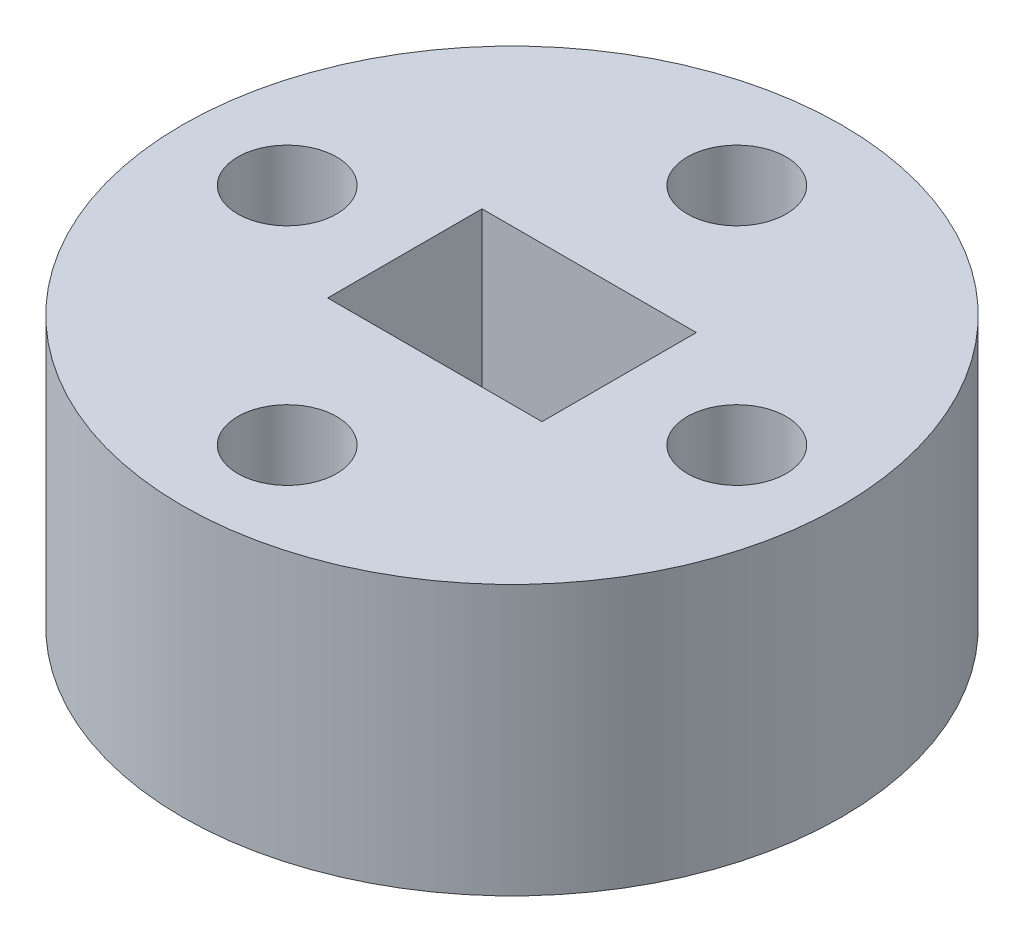
ISO-10303-21;
HEADER;
FILE_DESCRIPTION(('STEP AP214'),'2;1');
FILE_NAME('part.step','',(''),(''),'','','');
FILE_SCHEMA(('AUTOMOTIVE_DESIGN { 1 0 10303 214 1 1 1 1 }'));
ENDSEC;
DATA;
#1=APPLICATION_CONTEXT('core data for automotive mechanical design processes');
#2=APPLICATION_PROTOCOL_DEFINITION('international standard','automotive_design',2000,#1);
#3=PRODUCT_CONTEXT('',#1,'mechanical');
#4=PRODUCT('Part','Part','',(#3));
#5=PRODUCT_RELATED_PRODUCT_CATEGORY('part','',(#4));
#6=PRODUCT_DEFINITION_FORMATION('','',#4);
#7=PRODUCT_DEFINITION_CONTEXT('part definition',#1,'design');
#8=PRODUCT_DEFINITION('design','',#6,#7);
#9=PRODUCT_DEFINITION_SHAPE('','',#8);
#10=(LENGTH_UNIT() NAMED_UNIT(*) SI_UNIT(.MILLI.,.METRE.));
#11=(NAMED_UNIT(*) PLANE_ANGLE_UNIT() SI_UNIT($,.RADIAN.));
#12=(NAMED_UNIT(*) SI_UNIT($,.STERADIAN.) SOLID_ANGLE_UNIT());
#13=UNCERTAINTY_MEASURE_WITH_UNIT(LENGTH_MEASURE(1.E-05),#10,'distance_accuracy_value','');
#14=(GEOMETRIC_REPRESENTATION_CONTEXT(3) GLOBAL_UNCERTAINTY_ASSIGNED_CONTEXT((#13)) GLOBAL_UNIT_ASSIGNED_CONTEXT((#10,
#11,#12)) REPRESENTATION_CONTEXT('',''));
#15=CARTESIAN_POINT('',(0.,0.,0.));
#16=DIRECTION('',(0.,0.,1.));
#17=DIRECTION('',(1.,0.,0.));
#18=AXIS2_PLACEMENT_3D('',#15,#16,#17);
#19=CARTESIAN_POINT('',(0.,18.,0.));
#20=DIRECTION('',(0.,1.,0.));
#21=DIRECTION('',(0.,0.,1.));
#22=AXIS2_PLACEMENT_3D('',#19,#20,#21);
#23=PLANE('',#22);
#24=CARTESIAN_POINT('',(0.,18.,15.));
#25=DIRECTION('',(0.,1.,0.));
#26=DIRECTION('',(0.,0.,1.));
#27=AXIS2_PLACEMENT_3D('',#24,#25,#26);
#28=CIRCLE('',#27,3.3);
#29=CARTESIAN_POINT('',(0.,18.,18.3));
#30=VERTEX_POINT('',#29);
#31=EDGE_CURVE('E211',#30,#30,#28,.T.);
#32=ORIENTED_EDGE('',*,*,#31,.F.);
#33=EDGE_LOOP('',(#32));
#34=FACE_BOUND('',#33,.T.);
#35=CARTESIAN_POINT('',(-15.,18.,0.));
#36=DIRECTION('',(0.,1.,0.));
#37=DIRECTION('',(0.,0.,1.));
#38=AXIS2_PLACEMENT_3D('',#35,#36,#37);
#39=CIRCLE('',#38,3.3);
#40=CARTESIAN_POINT('',(-15.,18.,3.3));
#41=VERTEX_POINT('',#40);
#42=EDGE_CURVE('E109',#41,#41,#39,.T.);
#43=ORIENTED_EDGE('',*,*,#42,.F.);
#44=EDGE_LOOP('',(#43));
#45=FACE_BOUND('',#44,.T.);
#46=CARTESIAN_POINT('',(0.,18.,0.));
#47=DIRECTION('',(0.,1.,0.));
#48=DIRECTION('',(0.,0.,1.));
#49=AXIS2_PLACEMENT_3D('',#46,#47,#48);
#50=CIRCLE('',#49,22.);
#51=CARTESIAN_POINT('',(0.,18.,22.));
#52=VERTEX_POINT('',#51);
#53=EDGE_CURVE('E11',#52,#52,#50,.T.);
#54=ORIENTED_EDGE('',*,*,#53,.T.);
#55=EDGE_LOOP('',(#54));
#56=FACE_BOUND('',#55,.T.);
#57=DIRECTION('',(1.,0.,0.));
#58=VECTOR('',#57,1.);
#59=CARTESIAN_POINT('',(-7.15,18.,5.15));
#60=LINE('',#59,#58);
#61=CARTESIAN_POINT('',(-7.15,18.,5.15));
#62=VERTEX_POINT('',#61);
#63=CARTESIAN_POINT('',(7.15,18.,5.15));
#64=VERTEX_POINT('',#63);
#65=EDGE_CURVE('E88',#62,#64,#60,.T.);
#66=ORIENTED_EDGE('',*,*,#65,.F.);
#67=DIRECTION('',(0.,0.,1.));
#68=VECTOR('',#67,1.);
#69=CARTESIAN_POINT('',(-7.15,18.,5.15));
#70=LINE('',#69,#68);
#71=CARTESIAN_POINT('',(-7.15,18.,-5.15));
#72=VERTEX_POINT('',#71);
#73=EDGE_CURVE('E79',#72,#62,#70,.T.);
#74=ORIENTED_EDGE('',*,*,#73,.F.);
#75=DIRECTION('',(-1.,0.,0.));
#76=VECTOR('',#75,1.);
#77=CARTESIAN_POINT('',(-7.15,18.,-5.15));
#78=LINE('',#77,#76);
#79=CARTESIAN_POINT('',(7.15,18.,-5.15));
#80=VERTEX_POINT('',#79);
#81=EDGE_CURVE('E105',#80,#72,#78,.T.);
#82=ORIENTED_EDGE('',*,*,#81,.F.);
#83=DIRECTION('',(0.,0.,-1.));
#84=VECTOR('',#83,1.);
#85=CARTESIAN_POINT('',(7.15,18.,5.15));
#86=LINE('',#85,#84);
#87=EDGE_CURVE('E99',#64,#80,#86,.T.);
#88=ORIENTED_EDGE('',*,*,#87,.F.);
#89=EDGE_LOOP('',(#66,#74,#82,#88));
#90=FACE_BOUND('',#89,.T.);
#91=CARTESIAN_POINT('',(15.,18.,0.));
#92=DIRECTION('',(0.,1.,0.));
#93=DIRECTION('',(0.,0.,1.));
#94=AXIS2_PLACEMENT_3D('',#91,#92,#93);
#95=CIRCLE('',#94,3.3);
#96=CARTESIAN_POINT('',(15.,18.,3.3));
#97=VERTEX_POINT('',#96);
#98=EDGE_CURVE('E219',#97,#97,#95,.T.);
#99=ORIENTED_EDGE('',*,*,#98,.F.);
#100=EDGE_LOOP('',(#99));
#101=FACE_BOUND('',#100,.T.);
#102=CARTESIAN_POINT('',(0.,18.,-15.));
#103=DIRECTION('',(0.,1.,0.));
#104=DIRECTION('',(0.,0.,1.));
#105=AXIS2_PLACEMENT_3D('',#102,#103,#104);
#106=CIRCLE('',#105,3.3);
#107=CARTESIAN_POINT('',(0.,18.,-11.7));
#108=VERTEX_POINT('',#107);
#109=EDGE_CURVE('E204',#108,#108,#106,.T.);
#110=ORIENTED_EDGE('',*,*,#109,.F.);
#111=EDGE_LOOP('',(#110));
#112=FACE_BOUND('',#111,.T.);
#113=ADVANCED_FACE('F39',(#34,#45,#56,#90,#101,#112),#23,.T.);
#114=CARTESIAN_POINT('',(0.,0.,0.));
#115=DIRECTION('',(0.,1.,0.));
#116=DIRECTION('',(0.,0.,1.));
#117=AXIS2_PLACEMENT_3D('',#114,#115,#116);
#118=PLANE('',#117);
#119=CARTESIAN_POINT('',(0.,0.,0.));
#120=DIRECTION('',(0.,1.,0.));
#121=DIRECTION('',(0.,0.,1.));
#122=AXIS2_PLACEMENT_3D('',#119,#120,#121);
#123=CIRCLE('',#122,22.);
#124=CARTESIAN_POINT('',(0.,0.,22.));
#125=VERTEX_POINT('',#124);
#126=EDGE_CURVE('E43',#125,#125,#123,.T.);
#127=ORIENTED_EDGE('',*,*,#126,.F.);
#128=EDGE_LOOP('',(#127));
#129=FACE_BOUND('',#128,.T.);
#130=DIRECTION('',(0.,0.,1.));
#131=VECTOR('',#130,1.);
#132=CARTESIAN_POINT('',(-7.15,0.,5.15));
#133=LINE('',#132,#131);
#134=CARTESIAN_POINT('',(-7.15,0.,-5.15));
#135=VERTEX_POINT('',#134);
#136=CARTESIAN_POINT('',(-7.15,0.,5.15));
#137=VERTEX_POINT('',#136);
#138=EDGE_CURVE('E62',#135,#137,#133,.T.);
#139=ORIENTED_EDGE('',*,*,#138,.T.);
#140=DIRECTION('',(1.,0.,0.));
#141=VECTOR('',#140,1.);
#142=CARTESIAN_POINT('',(-7.15,0.,5.15));
#143=LINE('',#142,#141);
#144=CARTESIAN_POINT('',(7.15,0.,5.15));
#145=VERTEX_POINT('',#144);
#146=EDGE_CURVE('E94',#137,#145,#143,.T.);
#147=ORIENTED_EDGE('',*,*,#146,.T.);
#148=DIRECTION('',(0.,0.,-1.));
#149=VECTOR('',#148,1.);
#150=CARTESIAN_POINT('',(7.15,0.,5.15));
#151=LINE('',#150,#149);
#152=CARTESIAN_POINT('',(7.15,0.,-5.15));
#153=VERTEX_POINT('',#152);
#154=EDGE_CURVE('E110',#145,#153,#151,.T.);
#155=ORIENTED_EDGE('',*,*,#154,.T.);
#156=DIRECTION('',(-1.,0.,0.));
#157=VECTOR('',#156,1.);
#158=CARTESIAN_POINT('',(-7.15,0.,-5.15));
#159=LINE('',#158,#157);
#160=EDGE_CURVE('E87',#153,#135,#159,.T.);
#161=ORIENTED_EDGE('',*,*,#160,.T.);
#162=EDGE_LOOP('',(#139,#147,#155,#161));
#163=FACE_BOUND('',#162,.T.);
#164=CARTESIAN_POINT('',(-15.,0.,0.));
#165=DIRECTION('',(0.,1.,0.));
#166=DIRECTION('',(0.,0.,1.));
#167=AXIS2_PLACEMENT_3D('',#164,#165,#166);
#168=CIRCLE('',#167,3.3);
#169=CARTESIAN_POINT('',(-15.,0.,3.3));
#170=VERTEX_POINT('',#169);
#171=EDGE_CURVE('E225',#170,#170,#168,.T.);
#172=ORIENTED_EDGE('',*,*,#171,.T.);
#173=EDGE_LOOP('',(#172));
#174=FACE_BOUND('',#173,.T.);
#175=CARTESIAN_POINT('',(15.,0.,0.));
#176=DIRECTION('',(0.,1.,0.));
#177=DIRECTION('',(0.,0.,1.));
#178=AXIS2_PLACEMENT_3D('',#175,#176,#177);
#179=CIRCLE('',#178,3.3);
#180=CARTESIAN_POINT('',(15.,0.,3.3));
#181=VERTEX_POINT('',#180);
#182=EDGE_CURVE('E218',#181,#181,#179,.T.);
#183=ORIENTED_EDGE('',*,*,#182,.T.);
#184=EDGE_LOOP('',(#183));
#185=FACE_BOUND('',#184,.T.);
#186=CARTESIAN_POINT('',(0.,0.,15.));
#187=DIRECTION('',(0.,1.,0.));
#188=DIRECTION('',(0.,0.,1.));
#189=AXIS2_PLACEMENT_3D('',#186,#187,#188);
#190=CIRCLE('',#189,3.3);
#191=CARTESIAN_POINT('',(0.,0.,18.3));
#192=VERTEX_POINT('',#191);
#193=EDGE_CURVE('E210',#192,#192,#190,.T.);
#194=ORIENTED_EDGE('',*,*,#193,.T.);
#195=EDGE_LOOP('',(#194));
#196=FACE_BOUND('',#195,.T.);
#197=CARTESIAN_POINT('',(0.,0.,-15.));
#198=DIRECTION('',(0.,1.,0.));
#199=DIRECTION('',(0.,0.,1.));
#200=AXIS2_PLACEMENT_3D('',#197,#198,#199);
#201=CIRCLE('',#200,3.3);
#202=CARTESIAN_POINT('',(0.,0.,-11.7));
#203=VERTEX_POINT('',#202);
#204=EDGE_CURVE('E207',#203,#203,#201,.T.);
#205=ORIENTED_EDGE('',*,*,#204,.T.);
#206=EDGE_LOOP('',(#205));
#207=FACE_BOUND('',#206,.T.);
#208=ADVANCED_FACE('F123',(#129,#163,#174,#185,#196,#207),#118,.F.);
#209=CARTESIAN_POINT('',(0.,18.,0.));
#210=DIRECTION('',(0.,-1.,0.));
#211=DIRECTION('',(0.,0.,-1.));
#212=AXIS2_PLACEMENT_3D('',#209,#210,#211);
#213=CYLINDRICAL_SURFACE('',#212,22.);
#214=ORIENTED_EDGE('',*,*,#53,.F.);
#215=EDGE_LOOP('',(#214));
#216=FACE_BOUND('',#215,.T.);
#217=ORIENTED_EDGE('',*,*,#126,.T.);
#218=EDGE_LOOP('',(#217));
#219=FACE_BOUND('',#218,.T.);
#220=ADVANCED_FACE('F41',(#216,#219),#213,.T.);
#221=CARTESIAN_POINT('',(-7.15,18.,5.15));
#222=DIRECTION('',(1.,0.,0.));
#223=DIRECTION('',(0.,0.,-1.));
#224=AXIS2_PLACEMENT_3D('',#221,#222,#223);
#225=PLANE('',#224);
#226=ORIENTED_EDGE('',*,*,#138,.F.);
#227=DIRECTION('',(0.,-1.,0.));
#228=VECTOR('',#227,1.);
#229=CARTESIAN_POINT('',(-7.15,18.,-5.15));
#230=LINE('',#229,#228);
#231=EDGE_CURVE('E84',#72,#135,#230,.T.);
#232=ORIENTED_EDGE('',*,*,#231,.F.);
#233=ORIENTED_EDGE('',*,*,#73,.T.);
#234=DIRECTION('',(0.,-1.,0.));
#235=VECTOR('',#234,1.);
#236=CARTESIAN_POINT('',(-7.15,18.,5.15));
#237=LINE('',#236,#235);
#238=EDGE_CURVE('E81',#62,#137,#237,.T.);
#239=ORIENTED_EDGE('',*,*,#238,.T.);
#240=EDGE_LOOP('',(#226,#232,#233,#239));
#241=FACE_BOUND('',#240,.T.);
#242=ADVANCED_FACE('F85',(#241),#225,.T.);
#243=CARTESIAN_POINT('',(-7.15,18.,5.15));
#244=DIRECTION('',(0.,0.,-1.));
#245=DIRECTION('',(-1.,0.,0.));
#246=AXIS2_PLACEMENT_3D('',#243,#244,#245);
#247=PLANE('',#246);
#248=ORIENTED_EDGE('',*,*,#146,.F.);
#249=ORIENTED_EDGE('',*,*,#238,.F.);
#250=ORIENTED_EDGE('',*,*,#65,.T.);
#251=DIRECTION('',(0.,-1.,0.));
#252=VECTOR('',#251,1.);
#253=CARTESIAN_POINT('',(7.15,18.,5.15));
#254=LINE('',#253,#252);
#255=EDGE_CURVE('E96',#64,#145,#254,.T.);
#256=ORIENTED_EDGE('',*,*,#255,.T.);
#257=EDGE_LOOP('',(#248,#249,#250,#256));
#258=FACE_BOUND('',#257,.T.);
#259=ADVANCED_FACE('F95',(#258),#247,.T.);
#260=CARTESIAN_POINT('',(7.15,18.,5.15));
#261=DIRECTION('',(-1.,0.,0.));
#262=DIRECTION('',(0.,0.,1.));
#263=AXIS2_PLACEMENT_3D('',#260,#261,#262);
#264=PLANE('',#263);
#265=ORIENTED_EDGE('',*,*,#154,.F.);
#266=ORIENTED_EDGE('',*,*,#255,.F.);
#267=ORIENTED_EDGE('',*,*,#87,.T.);
#268=DIRECTION('',(0.,-1.,0.));
#269=VECTOR('',#268,1.);
#270=CARTESIAN_POINT('',(7.15,18.,-5.15));
#271=LINE('',#270,#269);
#272=EDGE_CURVE('E53',#80,#153,#271,.T.);
#273=ORIENTED_EDGE('',*,*,#272,.T.);
#274=EDGE_LOOP('',(#265,#266,#267,#273));
#275=FACE_BOUND('',#274,.T.);
#276=ADVANCED_FACE('F118',(#275),#264,.T.);
#277=CARTESIAN_POINT('',(-7.15,18.,-5.15));
#278=DIRECTION('',(0.,0.,1.));
#279=DIRECTION('',(1.,0.,0.));
#280=AXIS2_PLACEMENT_3D('',#277,#278,#279);
#281=PLANE('',#280);
#282=ORIENTED_EDGE('',*,*,#160,.F.);
#283=ORIENTED_EDGE('',*,*,#272,.F.);
#284=ORIENTED_EDGE('',*,*,#81,.T.);
#285=ORIENTED_EDGE('',*,*,#231,.T.);
#286=EDGE_LOOP('',(#282,#283,#284,#285));
#287=FACE_BOUND('',#286,.T.);
#288=ADVANCED_FACE('F121',(#287),#281,.T.);
#289=CARTESIAN_POINT('',(-15.,18.,0.));
#290=DIRECTION('',(0.,-1.,0.));
#291=DIRECTION('',(0.,0.,-1.));
#292=AXIS2_PLACEMENT_3D('',#289,#290,#291);
#293=CYLINDRICAL_SURFACE('',#292,3.3);
#294=ORIENTED_EDGE('',*,*,#42,.T.);
#295=EDGE_LOOP('',(#294));
#296=FACE_BOUND('',#295,.T.);
#297=ORIENTED_EDGE('',*,*,#171,.F.);
#298=EDGE_LOOP('',(#297));
#299=FACE_BOUND('',#298,.T.);
#300=ADVANCED_FACE('F124',(#296,#299),#293,.F.);
#301=CARTESIAN_POINT('',(15.,18.,0.));
#302=DIRECTION('',(0.,-1.,0.));
#303=DIRECTION('',(0.,0.,-1.));
#304=AXIS2_PLACEMENT_3D('',#301,#302,#303);
#305=CYLINDRICAL_SURFACE('',#304,3.3);
#306=ORIENTED_EDGE('',*,*,#98,.T.);
#307=EDGE_LOOP('',(#306));
#308=FACE_BOUND('',#307,.T.);
#309=ORIENTED_EDGE('',*,*,#182,.F.);
#310=EDGE_LOOP('',(#309));
#311=FACE_BOUND('',#310,.T.);
#312=ADVANCED_FACE('F131',(#308,#311),#305,.F.);
#313=CARTESIAN_POINT('',(0.,18.,15.));
#314=DIRECTION('',(0.,-1.,0.));
#315=DIRECTION('',(0.,0.,-1.));
#316=AXIS2_PLACEMENT_3D('',#313,#314,#315);
#317=CYLINDRICAL_SURFACE('',#316,3.3);
#318=ORIENTED_EDGE('',*,*,#31,.T.);
#319=EDGE_LOOP('',(#318));
#320=FACE_BOUND('',#319,.T.);
#321=ORIENTED_EDGE('',*,*,#193,.F.);
#322=EDGE_LOOP('',(#321));
#323=FACE_BOUND('',#322,.T.);
#324=ADVANCED_FACE('F178',(#320,#323),#317,.F.);
#325=CARTESIAN_POINT('',(0.,18.,-15.));
#326=DIRECTION('',(0.,-1.,0.));
#327=DIRECTION('',(0.,0.,-1.));
#328=AXIS2_PLACEMENT_3D('',#325,#326,#327);
#329=CYLINDRICAL_SURFACE('',#328,3.3);
#330=ORIENTED_EDGE('',*,*,#109,.T.);
#331=EDGE_LOOP('',(#330));
#332=FACE_BOUND('',#331,.T.);
#333=ORIENTED_EDGE('',*,*,#204,.F.);
#334=EDGE_LOOP('',(#333));
#335=FACE_BOUND('',#334,.T.);
#336=ADVANCED_FACE('F187',(#332,#335),#329,.F.);
#337=CLOSED_SHELL('',(#113,#208,#220,#242,#259,#276,#288,#300,#312,#324,#336));
#338=MANIFOLD_SOLID_BREP('B2',#337);
#339=ADVANCED_BREP_SHAPE_REPRESENTATION('',(#18,#338),#14);
#340=SHAPE_DEFINITION_REPRESENTATION(#9,#339);
ENDSEC;
END-ISO-10303-21;
